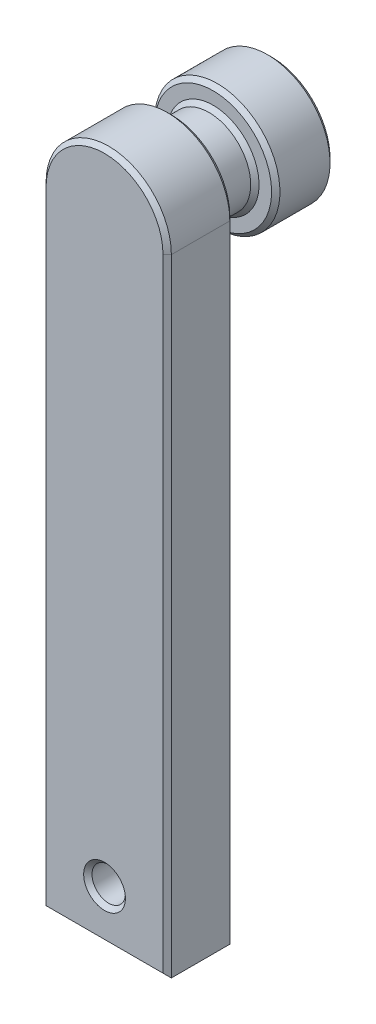
ISO-10303-21;
HEADER;
FILE_DESCRIPTION(('STEP AP214'),'2;1');
FILE_NAME('part.step','',(''),(''),'','','');
FILE_SCHEMA(('AUTOMOTIVE_DESIGN { 1 0 10303 214 1 1 1 1 }'));
ENDSEC;
DATA;
#1=APPLICATION_CONTEXT('core data for automotive mechanical design processes');
#2=APPLICATION_PROTOCOL_DEFINITION('international standard','automotive_design',2000,#1);
#3=PRODUCT_CONTEXT('',#1,'mechanical');
#4=PRODUCT('Part','Part','',(#3));
#5=PRODUCT_RELATED_PRODUCT_CATEGORY('part','',(#4));
#6=PRODUCT_DEFINITION_FORMATION('','',#4);
#7=PRODUCT_DEFINITION_CONTEXT('part definition',#1,'design');
#8=PRODUCT_DEFINITION('design','',#6,#7);
#9=PRODUCT_DEFINITION_SHAPE('','',#8);
#10=(LENGTH_UNIT() NAMED_UNIT(*) SI_UNIT(.MILLI.,.METRE.));
#11=(NAMED_UNIT(*) PLANE_ANGLE_UNIT() SI_UNIT($,.RADIAN.));
#12=(NAMED_UNIT(*) SI_UNIT($,.STERADIAN.) SOLID_ANGLE_UNIT());
#13=UNCERTAINTY_MEASURE_WITH_UNIT(LENGTH_MEASURE(1.E-05),#10,'distance_accuracy_value','');
#14=(GEOMETRIC_REPRESENTATION_CONTEXT(3) GLOBAL_UNCERTAINTY_ASSIGNED_CONTEXT((#13)) GLOBAL_UNIT_ASSIGNED_CONTEXT((#10,
#11,#12)) REPRESENTATION_CONTEXT('',''));
#15=CARTESIAN_POINT('',(0.,0.,0.));
#16=DIRECTION('',(0.,0.,1.));
#17=DIRECTION('',(1.,0.,0.));
#18=AXIS2_PLACEMENT_3D('',#15,#16,#17);
#19=CARTESIAN_POINT('',(0.,75.,8.));
#20=DIRECTION('',(0.,0.,-1.));
#21=DIRECTION('',(-1.,0.,0.));
#22=AXIS2_PLACEMENT_3D('',#19,#20,#21);
#23=PLANE('',#22);
#24=CARTESIAN_POINT('',(0.,6.,8.));
#25=DIRECTION('',(0.,0.,-1.));
#26=DIRECTION('',(-1.,0.,0.));
#27=AXIS2_PLACEMENT_3D('',#24,#25,#26);
#28=CIRCLE('',#27,2.5);
#29=CARTESIAN_POINT('',(-2.5,6.,8.));
#30=VERTEX_POINT('',#29);
#31=EDGE_CURVE('E134',#30,#30,#28,.T.);
#32=ORIENTED_EDGE('',*,*,#31,.T.);
#33=EDGE_LOOP('',(#32));
#34=FACE_BOUND('',#33,.T.);
#35=DIRECTION('',(0.,1.,0.));
#36=VECTOR('',#35,1.);
#37=CARTESIAN_POINT('',(7.,75.,8.));
#38=LINE('',#37,#36);
#39=CARTESIAN_POINT('',(7.00000000000003,0.499999999999987,8.));
#40=VERTEX_POINT('',#39);
#41=CARTESIAN_POINT('',(7.,75.,8.));
#42=VERTEX_POINT('',#41);
#43=EDGE_CURVE('E132',#40,#42,#38,.T.);
#44=ORIENTED_EDGE('',*,*,#43,.T.);
#45=CARTESIAN_POINT('',(0.,75.,8.));
#46=DIRECTION('',(0.,0.,-1.));
#47=DIRECTION('',(-1.,0.,0.));
#48=AXIS2_PLACEMENT_3D('',#45,#46,#47);
#49=CIRCLE('',#48,7.00000000000001);
#50=CARTESIAN_POINT('',(-7.00000000000002,75.,8.));
#51=VERTEX_POINT('',#50);
#52=EDGE_CURVE('E114',#42,#51,#49,.F.);
#53=ORIENTED_EDGE('',*,*,#52,.T.);
#54=DIRECTION('',(0.,-1.,0.));
#55=VECTOR('',#54,1.);
#56=CARTESIAN_POINT('',(-7.00000000000002,75.,8.));
#57=LINE('',#56,#55);
#58=CARTESIAN_POINT('',(-7.00000000000003,0.499999999999986,8.));
#59=VERTEX_POINT('',#58);
#60=EDGE_CURVE('E122',#51,#59,#57,.T.);
#61=ORIENTED_EDGE('',*,*,#60,.T.);
#62=DIRECTION('',(1.,0.,0.));
#63=VECTOR('',#62,1.);
#64=CARTESIAN_POINT('',(0.,0.499999999999987,8.));
#65=LINE('',#64,#63);
#66=EDGE_CURVE('E128',#59,#40,#65,.T.);
#67=ORIENTED_EDGE('',*,*,#66,.T.);
#68=EDGE_LOOP('',(#44,#53,#61,#67));
#69=FACE_BOUND('',#68,.T.);
#70=ADVANCED_FACE('F39',(#34,#69),#23,.F.);
#71=CARTESIAN_POINT('',(0.,75.,0.));
#72=DIRECTION('',(0.,0.,-1.));
#73=DIRECTION('',(-1.,0.,0.));
#74=AXIS2_PLACEMENT_3D('',#71,#72,#73);
#75=PLANE('',#74);
#76=CARTESIAN_POINT('',(0.,75.,0.));
#77=DIRECTION('',(0.,0.,-1.));
#78=DIRECTION('',(-1.,0.,0.));
#79=AXIS2_PLACEMENT_3D('',#76,#77,#78);
#80=CIRCLE('',#79,5.5);
#81=CARTESIAN_POINT('',(-5.5,75.,0.));
#82=VERTEX_POINT('',#81);
#83=EDGE_CURVE('E11',#82,#82,#80,.F.);
#84=ORIENTED_EDGE('',*,*,#83,.T.);
#85=EDGE_LOOP('',(#84));
#86=FACE_BOUND('',#85,.T.);
#87=DIRECTION('',(0.,-1.,0.));
#88=VECTOR('',#87,1.);
#89=CARTESIAN_POINT('',(7.00000000000001,0.,0.));
#90=LINE('',#89,#88);
#91=CARTESIAN_POINT('',(7.,75.,0.));
#92=VERTEX_POINT('',#91);
#93=CARTESIAN_POINT('',(7.00000000000001,0.500000000000001,0.));
#94=VERTEX_POINT('',#93);
#95=EDGE_CURVE('E57',#92,#94,#90,.T.);
#96=ORIENTED_EDGE('',*,*,#95,.T.);
#97=DIRECTION('',(-1.,0.,0.));
#98=VECTOR('',#97,1.);
#99=CARTESIAN_POINT('',(-7.50000000000001,0.499999999999999,0.));
#100=LINE('',#99,#98);
#101=CARTESIAN_POINT('',(-7.00000000000001,0.5,0.));
#102=VERTEX_POINT('',#101);
#103=EDGE_CURVE('E49',#94,#102,#100,.T.);
#104=ORIENTED_EDGE('',*,*,#103,.T.);
#105=DIRECTION('',(0.,1.,0.));
#106=VECTOR('',#105,1.);
#107=CARTESIAN_POINT('',(-7.00000000000001,75.,0.));
#108=LINE('',#107,#106);
#109=CARTESIAN_POINT('',(-7.,75.,0.));
#110=VERTEX_POINT('',#109);
#111=EDGE_CURVE('E180',#102,#110,#108,.T.);
#112=ORIENTED_EDGE('',*,*,#111,.T.);
#113=CARTESIAN_POINT('',(0.,75.,0.));
#114=DIRECTION('',(0.,0.,-1.));
#115=DIRECTION('',(-1.,0.,0.));
#116=AXIS2_PLACEMENT_3D('',#113,#114,#115);
#117=CIRCLE('',#116,7.);
#118=EDGE_CURVE('E178',#110,#92,#117,.T.);
#119=ORIENTED_EDGE('',*,*,#118,.T.);
#120=EDGE_LOOP('',(#96,#104,#112,#119));
#121=FACE_BOUND('',#120,.T.);
#122=CARTESIAN_POINT('',(0.,6.,0.));
#123=DIRECTION('',(0.,0.,1.));
#124=DIRECTION('',(1.,0.,0.));
#125=AXIS2_PLACEMENT_3D('',#122,#123,#124);
#126=CIRCLE('',#125,2.);
#127=CARTESIAN_POINT('',(2.,6.,0.));
#128=VERTEX_POINT('',#127);
#129=EDGE_CURVE('E189',#128,#128,#126,.T.);
#130=ORIENTED_EDGE('',*,*,#129,.T.);
#131=EDGE_LOOP('',(#130));
#132=FACE_BOUND('',#131,.T.);
#133=ADVANCED_FACE('F205',(#86,#121,#132),#75,.T.);
#134=CARTESIAN_POINT('',(-7.50000000000001,75.,8.));
#135=DIRECTION('',(1.,0.,0.));
#136=DIRECTION('',(0.,1.,0.));
#137=AXIS2_PLACEMENT_3D('',#134,#135,#136);
#138=PLANE('',#137);
#139=DIRECTION('',(0.,0.,-1.));
#140=VECTOR('',#139,1.);
#141=CARTESIAN_POINT('',(-7.50000000000001,0.,8.));
#142=LINE('',#141,#140);
#143=CARTESIAN_POINT('',(-7.50000000000001,0.,7.50000000000001));
#144=VERTEX_POINT('',#143);
#145=CARTESIAN_POINT('',(-7.50000000000001,0.,0.500000000000001));
#146=VERTEX_POINT('',#145);
#147=EDGE_CURVE('E221',#144,#146,#142,.T.);
#148=ORIENTED_EDGE('',*,*,#147,.F.);
#149=DIRECTION('',(0.,1.,0.));
#150=VECTOR('',#149,1.);
#151=CARTESIAN_POINT('',(-7.50000000000001,75.,7.50000000000001));
#152=LINE('',#151,#150);
#153=CARTESIAN_POINT('',(-7.5,75.,7.50000000000001));
#154=VERTEX_POINT('',#153);
#155=EDGE_CURVE('E155',#144,#154,#152,.T.);
#156=ORIENTED_EDGE('',*,*,#155,.T.);
#157=DIRECTION('',(0.,0.,-1.));
#158=VECTOR('',#157,1.);
#159=CARTESIAN_POINT('',(-7.5,75.,8.));
#160=LINE('',#159,#158);
#161=CARTESIAN_POINT('',(-7.5,75.,0.500000000000001));
#162=VERTEX_POINT('',#161);
#163=EDGE_CURVE('E227',#154,#162,#160,.T.);
#164=ORIENTED_EDGE('',*,*,#163,.T.);
#165=DIRECTION('',(0.,-1.,0.));
#166=VECTOR('',#165,1.);
#167=CARTESIAN_POINT('',(-7.50000000000001,0.,0.500000000000001));
#168=LINE('',#167,#166);
#169=EDGE_CURVE('E153',#162,#146,#168,.T.);
#170=ORIENTED_EDGE('',*,*,#169,.T.);
#171=EDGE_LOOP('',(#148,#156,#164,#170));
#172=FACE_BOUND('',#171,.T.);
#173=ADVANCED_FACE('F265',(#172),#138,.F.);
#174=CARTESIAN_POINT('',(7.50000000000001,0.,8.));
#175=DIRECTION('',(0.,1.,0.));
#176=DIRECTION('',(-1.,0.,0.));
#177=AXIS2_PLACEMENT_3D('',#174,#175,#176);
#178=PLANE('',#177);
#179=DIRECTION('',(0.,0.,-1.));
#180=VECTOR('',#179,1.);
#181=CARTESIAN_POINT('',(7.50000000000001,0.,8.));
#182=LINE('',#181,#180);
#183=CARTESIAN_POINT('',(7.50000000000001,0.,7.50000000000001));
#184=VERTEX_POINT('',#183);
#185=CARTESIAN_POINT('',(7.50000000000001,0.,0.500000000000001));
#186=VERTEX_POINT('',#185);
#187=EDGE_CURVE('E218',#184,#186,#182,.T.);
#188=ORIENTED_EDGE('',*,*,#187,.F.);
#189=DIRECTION('',(-1.,0.,0.));
#190=VECTOR('',#189,1.);
#191=CARTESIAN_POINT('',(7.50000000000001,0.,7.50000000000001));
#192=LINE('',#191,#190);
#193=EDGE_CURVE('E151',#184,#144,#192,.T.);
#194=ORIENTED_EDGE('',*,*,#193,.T.);
#195=ORIENTED_EDGE('',*,*,#147,.T.);
#196=DIRECTION('',(1.,0.,0.));
#197=VECTOR('',#196,1.);
#198=CARTESIAN_POINT('',(7.50000000000001,0.,0.5));
#199=LINE('',#198,#197);
#200=EDGE_CURVE('E148',#146,#186,#199,.T.);
#201=ORIENTED_EDGE('',*,*,#200,.T.);
#202=EDGE_LOOP('',(#188,#194,#195,#201));
#203=FACE_BOUND('',#202,.T.);
#204=ADVANCED_FACE('F217',(#203),#178,.F.);
#205=CARTESIAN_POINT('',(7.49999999999999,75.,8.));
#206=DIRECTION('',(-1.,0.,0.));
#207=DIRECTION('',(0.,-1.,0.));
#208=AXIS2_PLACEMENT_3D('',#205,#206,#207);
#209=PLANE('',#208);
#210=DIRECTION('',(0.,0.,-1.));
#211=VECTOR('',#210,1.);
#212=CARTESIAN_POINT('',(7.49999999999999,75.,8.));
#213=LINE('',#212,#211);
#214=CARTESIAN_POINT('',(7.49999999999999,75.,7.50000000000001));
#215=VERTEX_POINT('',#214);
#216=CARTESIAN_POINT('',(7.49999999999999,75.,0.500000000000001));
#217=VERTEX_POINT('',#216);
#218=EDGE_CURVE('E224',#215,#217,#213,.T.);
#219=ORIENTED_EDGE('',*,*,#218,.F.);
#220=DIRECTION('',(0.,-1.,0.));
#221=VECTOR('',#220,1.);
#222=CARTESIAN_POINT('',(7.49999999999999,75.,7.50000000000001));
#223=LINE('',#222,#221);
#224=EDGE_CURVE('E146',#215,#184,#223,.T.);
#225=ORIENTED_EDGE('',*,*,#224,.T.);
#226=ORIENTED_EDGE('',*,*,#187,.T.);
#227=DIRECTION('',(0.,1.,0.));
#228=VECTOR('',#227,1.);
#229=CARTESIAN_POINT('',(7.49999999999999,75.,0.500000000000001));
#230=LINE('',#229,#228);
#231=EDGE_CURVE('E144',#186,#217,#230,.T.);
#232=ORIENTED_EDGE('',*,*,#231,.T.);
#233=EDGE_LOOP('',(#219,#225,#226,#232));
#234=FACE_BOUND('',#233,.T.);
#235=ADVANCED_FACE('F222',(#234),#209,.F.);
#236=CARTESIAN_POINT('',(0.,75.,8.));
#237=DIRECTION('',(0.,0.,-1.));
#238=DIRECTION('',(-1.,0.,0.));
#239=AXIS2_PLACEMENT_3D('',#236,#237,#238);
#240=CYLINDRICAL_SURFACE('',#239,7.5);
#241=ORIENTED_EDGE('',*,*,#163,.F.);
#242=CARTESIAN_POINT('',(0.,75.,7.50000000000001));
#243=DIRECTION('',(0.,0.,-1.));
#244=DIRECTION('',(-1.,0.,0.));
#245=AXIS2_PLACEMENT_3D('',#242,#243,#244);
#246=CIRCLE('',#245,7.5);
#247=EDGE_CURVE('E116',#154,#215,#246,.T.);
#248=ORIENTED_EDGE('',*,*,#247,.T.);
#249=ORIENTED_EDGE('',*,*,#218,.T.);
#250=CARTESIAN_POINT('',(0.,75.,0.500000000000001));
#251=DIRECTION('',(0.,0.,-1.));
#252=DIRECTION('',(-1.,0.,0.));
#253=AXIS2_PLACEMENT_3D('',#250,#251,#252);
#254=CIRCLE('',#253,7.5);
#255=EDGE_CURVE('E137',#217,#162,#254,.F.);
#256=ORIENTED_EDGE('',*,*,#255,.T.);
#257=EDGE_LOOP('',(#241,#248,#249,#256));
#258=FACE_BOUND('',#257,.T.);
#259=ADVANCED_FACE('F239',(#258),#240,.T.);
#260=CARTESIAN_POINT('',(0.,6.,8.));
#261=DIRECTION('',(0.,0.,-1.));
#262=DIRECTION('',(-1.,0.,0.));
#263=AXIS2_PLACEMENT_3D('',#260,#261,#262);
#264=CYLINDRICAL_SURFACE('',#263,2.);
#265=CARTESIAN_POINT('',(0.,6.,7.50000000000001));
#266=DIRECTION('',(0.,0.,-1.));
#267=DIRECTION('',(-1.,0.,0.));
#268=AXIS2_PLACEMENT_3D('',#265,#266,#267);
#269=CIRCLE('',#268,2.);
#270=CARTESIAN_POINT('',(-2.,6.,7.50000000000001));
#271=VERTEX_POINT('',#270);
#272=EDGE_CURVE('E129',#271,#271,#269,.F.);
#273=ORIENTED_EDGE('',*,*,#272,.T.);
#274=EDGE_LOOP('',(#273));
#275=FACE_BOUND('',#274,.T.);
#276=ORIENTED_EDGE('',*,*,#129,.F.);
#277=EDGE_LOOP('',(#276));
#278=FACE_BOUND('',#277,.T.);
#279=ADVANCED_FACE('F246',(#275,#278),#264,.F.);
#280=CARTESIAN_POINT('',(0.,75.,-5.));
#281=DIRECTION('',(0.,0.,1.));
#282=DIRECTION('',(1.,0.,0.));
#283=AXIS2_PLACEMENT_3D('',#280,#281,#282);
#284=CYLINDRICAL_SURFACE('',#283,5.00000000000001);
#285=CARTESIAN_POINT('',(0.,75.,-4.5));
#286=DIRECTION('',(0.,0.,-1.));
#287=DIRECTION('',(-1.,0.,0.));
#288=AXIS2_PLACEMENT_3D('',#285,#286,#287);
#289=CIRCLE('',#288,5.00000000000001);
#290=CARTESIAN_POINT('',(-5.00000000000001,75.,-4.5));
#291=VERTEX_POINT('',#290);
#292=EDGE_CURVE('E175',#291,#291,#289,.F.);
#293=ORIENTED_EDGE('',*,*,#292,.T.);
#294=EDGE_LOOP('',(#293));
#295=FACE_BOUND('',#294,.T.);
#296=CARTESIAN_POINT('',(0.,75.,-0.500000000000002));
#297=DIRECTION('',(0.,0.,-1.));
#298=DIRECTION('',(-1.,0.,0.));
#299=AXIS2_PLACEMENT_3D('',#296,#297,#298);
#300=CIRCLE('',#299,5.00000000000001);
#301=CARTESIAN_POINT('',(-5.00000000000001,75.,-0.500000000000002));
#302=VERTEX_POINT('',#301);
#303=EDGE_CURVE('E172',#302,#302,#300,.T.);
#304=ORIENTED_EDGE('',*,*,#303,.T.);
#305=EDGE_LOOP('',(#304));
#306=FACE_BOUND('',#305,.T.);
#307=ADVANCED_FACE('F248',(#295,#306),#284,.T.);
#308=CARTESIAN_POINT('',(0.,75.,-12.));
#309=DIRECTION('',(0.,0.,1.));
#310=DIRECTION('',(1.,0.,0.));
#311=AXIS2_PLACEMENT_3D('',#308,#309,#310);
#312=CYLINDRICAL_SURFACE('',#311,7.49999999999999);
#313=CARTESIAN_POINT('',(0.,75.,-5.50000000000001));
#314=DIRECTION('',(0.,0.,-1.));
#315=DIRECTION('',(-1.,0.,0.));
#316=AXIS2_PLACEMENT_3D('',#313,#314,#315);
#317=CIRCLE('',#316,7.49999999999999);
#318=CARTESIAN_POINT('',(-7.49999999999999,75.,-5.50000000000001));
#319=VERTEX_POINT('',#318);
#320=EDGE_CURVE('E160',#319,#319,#317,.T.);
#321=ORIENTED_EDGE('',*,*,#320,.T.);
#322=EDGE_LOOP('',(#321));
#323=FACE_BOUND('',#322,.T.);
#324=CARTESIAN_POINT('',(0.,75.,-11.5));
#325=DIRECTION('',(0.,0.,-1.));
#326=DIRECTION('',(-1.,0.,0.));
#327=AXIS2_PLACEMENT_3D('',#324,#325,#326);
#328=CIRCLE('',#327,7.49999999999999);
#329=CARTESIAN_POINT('',(-7.49999999999999,75.,-11.5));
#330=VERTEX_POINT('',#329);
#331=EDGE_CURVE('E157',#330,#330,#328,.F.);
#332=ORIENTED_EDGE('',*,*,#331,.T.);
#333=EDGE_LOOP('',(#332));
#334=FACE_BOUND('',#333,.T.);
#335=ADVANCED_FACE('F255',(#323,#334),#312,.T.);
#336=CARTESIAN_POINT('',(0.,75.,-12.));
#337=DIRECTION('',(0.,0.,-1.));
#338=DIRECTION('',(-1.,0.,0.));
#339=AXIS2_PLACEMENT_3D('',#336,#337,#338);
#340=PLANE('',#339);
#341=CARTESIAN_POINT('',(0.,75.,-12.));
#342=DIRECTION('',(0.,0.,-1.));
#343=DIRECTION('',(-1.,0.,0.));
#344=AXIS2_PLACEMENT_3D('',#341,#342,#343);
#345=CIRCLE('',#344,7.00000000000001);
#346=CARTESIAN_POINT('',(-7.00000000000001,75.,-12.));
#347=VERTEX_POINT('',#346);
#348=EDGE_CURVE('E169',#347,#347,#345,.T.);
#349=ORIENTED_EDGE('',*,*,#348,.T.);
#350=EDGE_LOOP('',(#349));
#351=FACE_BOUND('',#350,.T.);
#352=ADVANCED_FACE('F391',(#351),#340,.T.);
#353=CARTESIAN_POINT('',(0.,75.,-5.));
#354=DIRECTION('',(0.,0.,-1.));
#355=DIRECTION('',(-1.,0.,0.));
#356=AXIS2_PLACEMENT_3D('',#353,#354,#355);
#357=PLANE('',#356);
#358=CARTESIAN_POINT('',(0.,75.,-5.));
#359=DIRECTION('',(0.,0.,-1.));
#360=DIRECTION('',(-1.,0.,0.));
#361=AXIS2_PLACEMENT_3D('',#358,#359,#360);
#362=CIRCLE('',#361,6.99999999999998);
#363=CARTESIAN_POINT('',(-6.99999999999998,75.,-5.));
#364=VERTEX_POINT('',#363);
#365=EDGE_CURVE('E166',#364,#364,#362,.F.);
#366=ORIENTED_EDGE('',*,*,#365,.T.);
#367=EDGE_LOOP('',(#366));
#368=FACE_BOUND('',#367,.T.);
#369=CARTESIAN_POINT('',(0.,75.,-5.));
#370=DIRECTION('',(0.,0.,-1.));
#371=DIRECTION('',(-1.,0.,0.));
#372=AXIS2_PLACEMENT_3D('',#369,#370,#371);
#373=CIRCLE('',#372,5.49999999999999);
#374=CARTESIAN_POINT('',(-5.49999999999999,75.,-5.));
#375=VERTEX_POINT('',#374);
#376=EDGE_CURVE('E163',#375,#375,#373,.T.);
#377=ORIENTED_EDGE('',*,*,#376,.T.);
#378=EDGE_LOOP('',(#377));
#379=FACE_BOUND('',#378,.T.);
#380=ADVANCED_FACE('F282',(#368,#379),#357,.F.);
#381=CARTESIAN_POINT('',(0.,6.,7.50000000000001));
#382=DIRECTION('',(0.,0.,1.));
#383=DIRECTION('',(1.,0.,0.));
#384=AXIS2_PLACEMENT_3D('',#381,#382,#383);
#385=CONICAL_SURFACE('',#384,2.,0.785398163397455);
#386=ORIENTED_EDGE('',*,*,#31,.F.);
#387=EDGE_LOOP('',(#386));
#388=FACE_BOUND('',#387,.T.);
#389=ORIENTED_EDGE('',*,*,#272,.F.);
#390=EDGE_LOOP('',(#389));
#391=FACE_BOUND('',#390,.T.);
#392=ADVANCED_FACE('F276',(#388,#391),#385,.F.);
#393=CARTESIAN_POINT('',(0.,0.499999999999987,8.));
#394=DIRECTION('',(0.,0.707106781186546,-0.707106781186549));
#395=DIRECTION('',(1.,0.,0.));
#396=AXIS2_PLACEMENT_3D('',#393,#394,#395);
#397=PLANE('',#396);
#398=DIRECTION('',(0.577350269189625,0.577350269189627,0.577350269189625));
#399=VECTOR('',#398,1.);
#400=CARTESIAN_POINT('',(17.8333333333333,25.3333333333334,32.8333333333334));
#401=LINE('',#400,#399);
#402=EDGE_CURVE('E125',#144,#59,#401,.T.);
#403=ORIENTED_EDGE('',*,*,#402,.F.);
#404=ORIENTED_EDGE('',*,*,#193,.F.);
#405=DIRECTION('',(-0.577350269189625,0.577350269189627,0.577350269189625));
#406=VECTOR('',#405,1.);
#407=CARTESIAN_POINT('',(4.66666666666669,2.83333333333333,10.3333333333333));
#408=LINE('',#407,#406);
#409=EDGE_CURVE('E186',#40,#184,#408,.F.);
#410=ORIENTED_EDGE('',*,*,#409,.F.);
#411=ORIENTED_EDGE('',*,*,#66,.F.);
#412=EDGE_LOOP('',(#403,#404,#410,#411));
#413=FACE_BOUND('',#412,.T.);
#414=ADVANCED_FACE('F234',(#413),#397,.F.);
#415=CARTESIAN_POINT('',(7.,75.,8.));
#416=DIRECTION('',(-0.707106781186548,0.,-0.707106781186548));
#417=DIRECTION('',(0.,1.,0.));
#418=AXIS2_PLACEMENT_3D('',#415,#416,#417);
#419=PLANE('',#418);
#420=ORIENTED_EDGE('',*,*,#409,.T.);
#421=ORIENTED_EDGE('',*,*,#224,.F.);
#422=DIRECTION('',(0.707106781186548,0.,-0.707106781186548));
#423=VECTOR('',#422,1.);
#424=CARTESIAN_POINT('',(7.,75.,8.));
#425=LINE('',#424,#423);
#426=EDGE_CURVE('E119',#42,#215,#425,.T.);
#427=ORIENTED_EDGE('',*,*,#426,.F.);
#428=ORIENTED_EDGE('',*,*,#43,.F.);
#429=EDGE_LOOP('',(#420,#421,#427,#428));
#430=FACE_BOUND('',#429,.T.);
#431=ADVANCED_FACE('F236',(#430),#419,.F.);
#432=CARTESIAN_POINT('',(-7.00000000000002,75.,8.));
#433=DIRECTION('',(0.707106781186548,0.,-0.707106781186548));
#434=DIRECTION('',(0.,-1.,0.));
#435=AXIS2_PLACEMENT_3D('',#432,#433,#434);
#436=PLANE('',#435);
#437=ORIENTED_EDGE('',*,*,#402,.T.);
#438=ORIENTED_EDGE('',*,*,#60,.F.);
#439=DIRECTION('',(0.707106781186548,0.,0.707106781186548));
#440=VECTOR('',#439,1.);
#441=CARTESIAN_POINT('',(-7.50000000000001,75.,7.50000000000001));
#442=LINE('',#441,#440);
#443=EDGE_CURVE('E110',#154,#51,#442,.T.);
#444=ORIENTED_EDGE('',*,*,#443,.F.);
#445=ORIENTED_EDGE('',*,*,#155,.F.);
#446=EDGE_LOOP('',(#437,#438,#444,#445));
#447=FACE_BOUND('',#446,.T.);
#448=ADVANCED_FACE('F123',(#447),#436,.F.);
#449=CARTESIAN_POINT('',(0.,75.,8.));
#450=DIRECTION('',(0.,0.,-1.));
#451=DIRECTION('',(-1.,0.,0.));
#452=AXIS2_PLACEMENT_3D('',#449,#450,#451);
#453=CONICAL_SURFACE('',#452,7.00000000000001,0.785398163397448);
#454=ORIENTED_EDGE('',*,*,#426,.T.);
#455=ORIENTED_EDGE('',*,*,#247,.F.);
#456=ORIENTED_EDGE('',*,*,#443,.T.);
#457=ORIENTED_EDGE('',*,*,#52,.F.);
#458=EDGE_LOOP('',(#454,#455,#456,#457));
#459=FACE_BOUND('',#458,.T.);
#460=ADVANCED_FACE('F112',(#459),#453,.T.);
#461=CARTESIAN_POINT('',(0.,75.,-5.50000000000001));
#462=DIRECTION('',(0.,0.,-1.));
#463=DIRECTION('',(-1.,0.,0.));
#464=AXIS2_PLACEMENT_3D('',#461,#462,#463);
#465=CONICAL_SURFACE('',#464,7.49999999999999,0.785398163397448);
#466=ORIENTED_EDGE('',*,*,#365,.F.);
#467=EDGE_LOOP('',(#466));
#468=FACE_BOUND('',#467,.T.);
#469=ORIENTED_EDGE('',*,*,#320,.F.);
#470=EDGE_LOOP('',(#469));
#471=FACE_BOUND('',#470,.T.);
#472=ADVANCED_FACE('F291',(#468,#471),#465,.T.);
#473=CARTESIAN_POINT('',(0.,75.,-12.));
#474=DIRECTION('',(0.,0.,1.));
#475=DIRECTION('',(1.,0.,0.));
#476=AXIS2_PLACEMENT_3D('',#473,#474,#475);
#477=CONICAL_SURFACE('',#476,7.00000000000001,0.785398163397449);
#478=ORIENTED_EDGE('',*,*,#331,.F.);
#479=EDGE_LOOP('',(#478));
#480=FACE_BOUND('',#479,.T.);
#481=ORIENTED_EDGE('',*,*,#348,.F.);
#482=EDGE_LOOP('',(#481));
#483=FACE_BOUND('',#482,.T.);
#484=ADVANCED_FACE('F310',(#480,#483),#477,.T.);
#485=CARTESIAN_POINT('',(0.,75.,-4.5));
#486=DIRECTION('',(0.,0.,-1.));
#487=DIRECTION('',(-1.,0.,0.));
#488=AXIS2_PLACEMENT_3D('',#485,#486,#487);
#489=CONICAL_SURFACE('',#488,5.00000000000001,0.785398163397438);
#490=ORIENTED_EDGE('',*,*,#376,.F.);
#491=EDGE_LOOP('',(#490));
#492=FACE_BOUND('',#491,.T.);
#493=ORIENTED_EDGE('',*,*,#292,.F.);
#494=EDGE_LOOP('',(#493));
#495=FACE_BOUND('',#494,.T.);
#496=ADVANCED_FACE('F317',(#492,#495),#489,.T.);
#497=CARTESIAN_POINT('',(0.,75.,-0.500000000000002));
#498=DIRECTION('',(0.,0.,1.));
#499=DIRECTION('',(1.,0.,0.));
#500=AXIS2_PLACEMENT_3D('',#497,#498,#499);
#501=CONICAL_SURFACE('',#500,5.00000000000001,0.785398163397438);
#502=ORIENTED_EDGE('',*,*,#83,.F.);
#503=EDGE_LOOP('',(#502));
#504=FACE_BOUND('',#503,.T.);
#505=ORIENTED_EDGE('',*,*,#303,.F.);
#506=EDGE_LOOP('',(#505));
#507=FACE_BOUND('',#506,.T.);
#508=ADVANCED_FACE('F324',(#504,#507),#501,.T.);
#509=CARTESIAN_POINT('',(0.,75.,0.500000000000001));
#510=DIRECTION('',(0.,0.,1.));
#511=DIRECTION('',(1.,0.,0.));
#512=AXIS2_PLACEMENT_3D('',#509,#510,#511);
#513=CONICAL_SURFACE('',#512,7.5,0.785398163397447);
#514=DIRECTION('',(0.707106781186547,0.,0.707106781186548));
#515=VECTOR('',#514,1.);
#516=CARTESIAN_POINT('',(7.,75.,0.));
#517=LINE('',#516,#515);
#518=EDGE_CURVE('E192',#92,#217,#517,.T.);
#519=ORIENTED_EDGE('',*,*,#518,.F.);
#520=ORIENTED_EDGE('',*,*,#118,.F.);
#521=DIRECTION('',(0.707106781186547,0.,-0.707106781186548));
#522=VECTOR('',#521,1.);
#523=CARTESIAN_POINT('',(-7.5,75.,0.500000000000001));
#524=LINE('',#523,#522);
#525=EDGE_CURVE('E44',#162,#110,#524,.T.);
#526=ORIENTED_EDGE('',*,*,#525,.F.);
#527=ORIENTED_EDGE('',*,*,#255,.F.);
#528=EDGE_LOOP('',(#519,#520,#526,#527));
#529=FACE_BOUND('',#528,.T.);
#530=ADVANCED_FACE('F42',(#529),#513,.T.);
#531=CARTESIAN_POINT('',(-7.50000000000001,75.,0.500000000000001));
#532=DIRECTION('',(-0.707106781186548,0.,-0.707106781186547));
#533=DIRECTION('',(0.,1.,0.));
#534=AXIS2_PLACEMENT_3D('',#531,#532,#533);
#535=PLANE('',#534);
#536=ORIENTED_EDGE('',*,*,#525,.T.);
#537=ORIENTED_EDGE('',*,*,#111,.F.);
#538=DIRECTION('',(-0.577350269189624,-0.577350269189628,0.577350269189626));
#539=VECTOR('',#538,1.);
#540=CARTESIAN_POINT('',(17.5,25.0000000000001,-24.5000000000001));
#541=LINE('',#540,#539);
#542=EDGE_CURVE('E64',#146,#102,#541,.F.);
#543=ORIENTED_EDGE('',*,*,#542,.F.);
#544=ORIENTED_EDGE('',*,*,#169,.F.);
#545=EDGE_LOOP('',(#536,#537,#543,#544));
#546=FACE_BOUND('',#545,.T.);
#547=ADVANCED_FACE('F201',(#546),#535,.T.);
#548=CARTESIAN_POINT('',(7.49999999999999,75.,0.500000000000001));
#549=DIRECTION('',(0.707106781186548,0.,-0.707106781186547));
#550=DIRECTION('',(0.,-1.,0.));
#551=AXIS2_PLACEMENT_3D('',#548,#549,#550);
#552=PLANE('',#551);
#553=ORIENTED_EDGE('',*,*,#518,.T.);
#554=ORIENTED_EDGE('',*,*,#231,.F.);
#555=DIRECTION('',(-0.577350269189625,0.577350269189627,-0.577350269189625));
#556=VECTOR('',#555,1.);
#557=CARTESIAN_POINT('',(-17.5,25.0000000000001,-24.5000000000001));
#558=LINE('',#557,#556);
#559=EDGE_CURVE('E190',#94,#186,#558,.F.);
#560=ORIENTED_EDGE('',*,*,#559,.F.);
#561=ORIENTED_EDGE('',*,*,#95,.F.);
#562=EDGE_LOOP('',(#553,#554,#560,#561));
#563=FACE_BOUND('',#562,.T.);
#564=ADVANCED_FACE('F209',(#563),#552,.T.);
#565=CARTESIAN_POINT('',(7.50000000000001,0.,0.5));
#566=DIRECTION('',(0.,-0.707106781186546,-0.707106781186549));
#567=DIRECTION('',(-1.,0.,0.));
#568=AXIS2_PLACEMENT_3D('',#565,#566,#567);
#569=PLANE('',#568);
#570=ORIENTED_EDGE('',*,*,#542,.T.);
#571=ORIENTED_EDGE('',*,*,#103,.F.);
#572=ORIENTED_EDGE('',*,*,#559,.T.);
#573=ORIENTED_EDGE('',*,*,#200,.F.);
#574=EDGE_LOOP('',(#570,#571,#572,#573));
#575=FACE_BOUND('',#574,.T.);
#576=ADVANCED_FACE('F208',(#575),#569,.T.);
#577=CLOSED_SHELL('',(#70,#133,#173,#204,#235,#259,#279,#307,#335,#352,#380,#392,#414,#431,#448,
#460,#472,#484,#496,#508,#530,#547,#564,#576));
#578=MANIFOLD_SOLID_BREP('B2',#577);
#579=ADVANCED_BREP_SHAPE_REPRESENTATION('',(#18,#578),#14);
#580=SHAPE_DEFINITION_REPRESENTATION(#9,#579);
ENDSEC;
END-ISO-10303-21;
